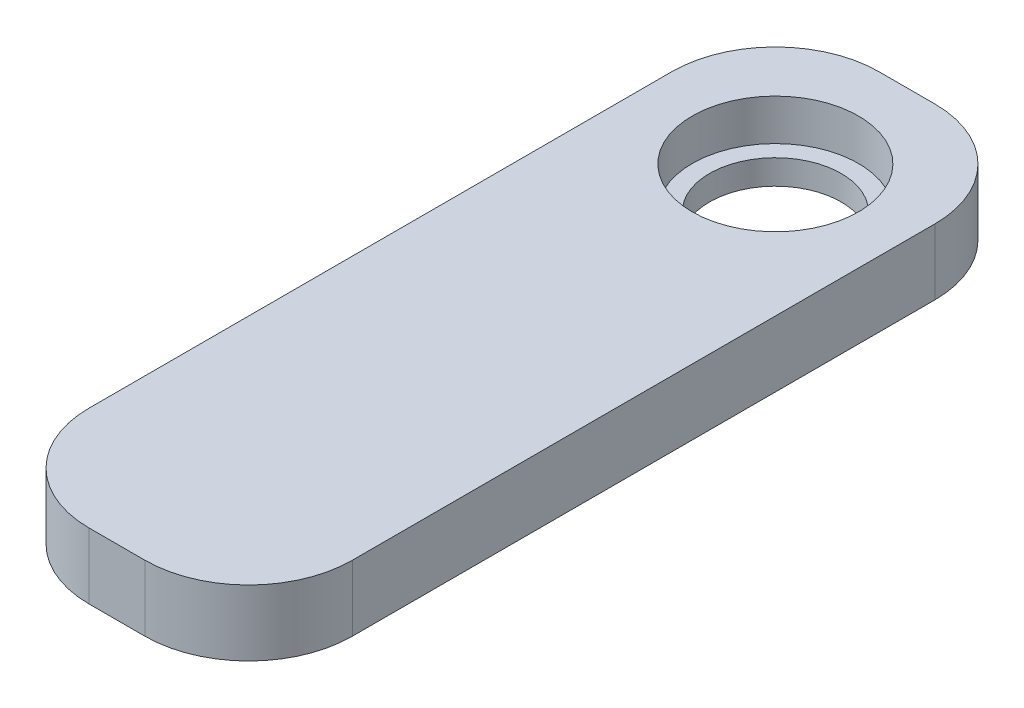
ISO-10303-21;
HEADER;
FILE_DESCRIPTION(('STEP AP214'),'2;1');
FILE_NAME('part.step','',(''),(''),'','','');
FILE_SCHEMA(('AUTOMOTIVE_DESIGN { 1 0 10303 214 1 1 1 1 }'));
ENDSEC;
DATA;
#1=APPLICATION_CONTEXT('core data for automotive mechanical design processes');
#2=APPLICATION_PROTOCOL_DEFINITION('international standard','automotive_design',2000,#1);
#3=PRODUCT_CONTEXT('',#1,'mechanical');
#4=PRODUCT('Part','Part','',(#3));
#5=PRODUCT_RELATED_PRODUCT_CATEGORY('part','',(#4));
#6=PRODUCT_DEFINITION_FORMATION('','',#4);
#7=PRODUCT_DEFINITION_CONTEXT('part definition',#1,'design');
#8=PRODUCT_DEFINITION('design','',#6,#7);
#9=PRODUCT_DEFINITION_SHAPE('','',#8);
#10=(LENGTH_UNIT() NAMED_UNIT(*) SI_UNIT(.MILLI.,.METRE.));
#11=(NAMED_UNIT(*) PLANE_ANGLE_UNIT() SI_UNIT($,.RADIAN.));
#12=(NAMED_UNIT(*) SI_UNIT($,.STERADIAN.) SOLID_ANGLE_UNIT());
#13=UNCERTAINTY_MEASURE_WITH_UNIT(LENGTH_MEASURE(1.E-05),#10,'distance_accuracy_value','');
#14=(GEOMETRIC_REPRESENTATION_CONTEXT(3) GLOBAL_UNCERTAINTY_ASSIGNED_CONTEXT((#13)) GLOBAL_UNIT_ASSIGNED_CONTEXT((#10,
#11,#12)) REPRESENTATION_CONTEXT('',''));
#15=CARTESIAN_POINT('',(0.,0.,0.));
#16=DIRECTION('',(0.,0.,1.));
#17=DIRECTION('',(1.,0.,0.));
#18=AXIS2_PLACEMENT_3D('',#15,#16,#17);
#19=CARTESIAN_POINT('',(0.,6.35,0.));
#20=DIRECTION('',(1.,0.,0.));
#21=DIRECTION('',(0.,0.,-1.));
#22=AXIS2_PLACEMENT_3D('',#19,#20,#21);
#23=PLANE('',#22);
#24=DIRECTION('',(0.,0.,1.));
#25=VECTOR('',#24,1.);
#26=CARTESIAN_POINT('',(0.,0.,0.));
#27=LINE('',#26,#25);
#28=CARTESIAN_POINT('',(0.,0.,-66.2));
#29=VERTEX_POINT('',#28);
#30=CARTESIAN_POINT('',(0.,0.,-9.99999999999999));
#31=VERTEX_POINT('',#30);
#32=EDGE_CURVE('E193',#29,#31,#27,.T.);
#33=ORIENTED_EDGE('',*,*,#32,.T.);
#34=DIRECTION('',(0.,-1.,0.));
#35=VECTOR('',#34,1.);
#36=CARTESIAN_POINT('',(0.,6.35,-10.));
#37=LINE('',#36,#35);
#38=CARTESIAN_POINT('',(0.,6.35,-9.99999999999999));
#39=VERTEX_POINT('',#38);
#40=EDGE_CURVE('E149',#31,#39,#37,.F.);
#41=ORIENTED_EDGE('',*,*,#40,.T.);
#42=DIRECTION('',(0.,0.,1.));
#43=VECTOR('',#42,1.);
#44=CARTESIAN_POINT('',(0.,6.35,0.));
#45=LINE('',#44,#43);
#46=CARTESIAN_POINT('',(0.,6.35,-66.2));
#47=VERTEX_POINT('',#46);
#48=EDGE_CURVE('E175',#47,#39,#45,.T.);
#49=ORIENTED_EDGE('',*,*,#48,.F.);
#50=DIRECTION('',(0.,-1.,0.));
#51=VECTOR('',#50,1.);
#52=CARTESIAN_POINT('',(0.,6.35,-66.2));
#53=LINE('',#52,#51);
#54=EDGE_CURVE('E146',#47,#29,#53,.T.);
#55=ORIENTED_EDGE('',*,*,#54,.T.);
#56=EDGE_LOOP('',(#33,#41,#49,#55));
#57=FACE_BOUND('',#56,.T.);
#58=ADVANCED_FACE('F35',(#57),#23,.F.);
#59=CARTESIAN_POINT('',(0.,6.35,0.));
#60=DIRECTION('',(0.,0.,-1.));
#61=DIRECTION('',(-1.,0.,0.));
#62=AXIS2_PLACEMENT_3D('',#59,#60,#61);
#63=PLANE('',#62);
#64=DIRECTION('',(1.,0.,0.));
#65=VECTOR('',#64,1.);
#66=CARTESIAN_POINT('',(0.,6.35,0.));
#67=LINE('',#66,#65);
#68=CARTESIAN_POINT('',(10.,6.35,0.));
#69=VERTEX_POINT('',#68);
#70=CARTESIAN_POINT('',(15.4,6.35,0.));
#71=VERTEX_POINT('',#70);
#72=EDGE_CURVE('E179',#69,#71,#67,.T.);
#73=ORIENTED_EDGE('',*,*,#72,.F.);
#74=DIRECTION('',(0.,-1.,0.));
#75=VECTOR('',#74,1.);
#76=CARTESIAN_POINT('',(10.,6.35,0.));
#77=LINE('',#76,#75);
#78=CARTESIAN_POINT('',(10.,0.,0.));
#79=VERTEX_POINT('',#78);
#80=EDGE_CURVE('E132',#69,#79,#77,.T.);
#81=ORIENTED_EDGE('',*,*,#80,.T.);
#82=DIRECTION('',(1.,0.,0.));
#83=VECTOR('',#82,1.);
#84=CARTESIAN_POINT('',(0.,0.,0.));
#85=LINE('',#84,#83);
#86=CARTESIAN_POINT('',(15.4,0.,0.));
#87=VERTEX_POINT('',#86);
#88=EDGE_CURVE('E181',#79,#87,#85,.T.);
#89=ORIENTED_EDGE('',*,*,#88,.T.);
#90=DIRECTION('',(0.,-1.,0.));
#91=VECTOR('',#90,1.);
#92=CARTESIAN_POINT('',(15.4,6.35,0.));
#93=LINE('',#92,#91);
#94=EDGE_CURVE('E130',#87,#71,#93,.F.);
#95=ORIENTED_EDGE('',*,*,#94,.T.);
#96=EDGE_LOOP('',(#73,#81,#89,#95));
#97=FACE_BOUND('',#96,.T.);
#98=ADVANCED_FACE('F200',(#97),#63,.F.);
#99=CARTESIAN_POINT('',(25.4,6.35,0.));
#100=DIRECTION('',(-1.,0.,0.));
#101=DIRECTION('',(0.,0.,1.));
#102=AXIS2_PLACEMENT_3D('',#99,#100,#101);
#103=PLANE('',#102);
#104=DIRECTION('',(0.,0.,-1.));
#105=VECTOR('',#104,1.);
#106=CARTESIAN_POINT('',(25.4,6.35,0.));
#107=LINE('',#106,#105);
#108=CARTESIAN_POINT('',(25.4,6.35,-10.));
#109=VERTEX_POINT('',#108);
#110=CARTESIAN_POINT('',(25.4,6.35,-66.2));
#111=VERTEX_POINT('',#110);
#112=EDGE_CURVE('E187',#109,#111,#107,.T.);
#113=ORIENTED_EDGE('',*,*,#112,.F.);
#114=DIRECTION('',(0.,-1.,0.));
#115=VECTOR('',#114,1.);
#116=CARTESIAN_POINT('',(25.4,6.35,-10.));
#117=LINE('',#116,#115);
#118=CARTESIAN_POINT('',(25.4,0.,-10.));
#119=VERTEX_POINT('',#118);
#120=EDGE_CURVE('E160',#109,#119,#117,.T.);
#121=ORIENTED_EDGE('',*,*,#120,.T.);
#122=DIRECTION('',(0.,0.,-1.));
#123=VECTOR('',#122,1.);
#124=CARTESIAN_POINT('',(25.4,0.,0.));
#125=LINE('',#124,#123);
#126=CARTESIAN_POINT('',(25.4,0.,-66.2));
#127=VERTEX_POINT('',#126);
#128=EDGE_CURVE('E176',#119,#127,#125,.T.);
#129=ORIENTED_EDGE('',*,*,#128,.T.);
#130=DIRECTION('',(0.,-1.,0.));
#131=VECTOR('',#130,1.);
#132=CARTESIAN_POINT('',(25.4,6.35,-66.2));
#133=LINE('',#132,#131);
#134=EDGE_CURVE('E158',#127,#111,#133,.F.);
#135=ORIENTED_EDGE('',*,*,#134,.T.);
#136=EDGE_LOOP('',(#113,#121,#129,#135));
#137=FACE_BOUND('',#136,.T.);
#138=ADVANCED_FACE('F211',(#137),#103,.F.);
#139=CARTESIAN_POINT('',(0.,6.35,-76.2));
#140=DIRECTION('',(0.,0.,1.));
#141=DIRECTION('',(1.,0.,0.));
#142=AXIS2_PLACEMENT_3D('',#139,#140,#141);
#143=PLANE('',#142);
#144=DIRECTION('',(-1.,0.,0.));
#145=VECTOR('',#144,1.);
#146=CARTESIAN_POINT('',(0.,0.,-76.2));
#147=LINE('',#146,#145);
#148=CARTESIAN_POINT('',(15.4,0.,-76.2));
#149=VERTEX_POINT('',#148);
#150=CARTESIAN_POINT('',(9.99999999999998,0.,-76.2));
#151=VERTEX_POINT('',#150);
#152=EDGE_CURVE('E166',#149,#151,#147,.T.);
#153=ORIENTED_EDGE('',*,*,#152,.T.);
#154=DIRECTION('',(0.,-1.,0.));
#155=VECTOR('',#154,1.);
#156=CARTESIAN_POINT('',(9.99999999999998,6.35,-76.2));
#157=LINE('',#156,#155);
#158=CARTESIAN_POINT('',(9.99999999999998,6.35,-76.2));
#159=VERTEX_POINT('',#158);
#160=EDGE_CURVE('E11',#151,#159,#157,.F.);
#161=ORIENTED_EDGE('',*,*,#160,.T.);
#162=DIRECTION('',(-1.,0.,0.));
#163=VECTOR('',#162,1.);
#164=CARTESIAN_POINT('',(0.,6.35,-76.2));
#165=LINE('',#164,#163);
#166=CARTESIAN_POINT('',(15.4,6.35,-76.2));
#167=VERTEX_POINT('',#166);
#168=EDGE_CURVE('E167',#167,#159,#165,.T.);
#169=ORIENTED_EDGE('',*,*,#168,.F.);
#170=DIRECTION('',(0.,-1.,0.));
#171=VECTOR('',#170,1.);
#172=CARTESIAN_POINT('',(15.4,6.35,-76.2));
#173=LINE('',#172,#171);
#174=EDGE_CURVE('E43',#167,#149,#173,.T.);
#175=ORIENTED_EDGE('',*,*,#174,.T.);
#176=EDGE_LOOP('',(#153,#161,#169,#175));
#177=FACE_BOUND('',#176,.T.);
#178=ADVANCED_FACE('F165',(#177),#143,.F.);
#179=CARTESIAN_POINT('',(0.,6.35,0.));
#180=DIRECTION('',(0.,-1.,0.));
#181=DIRECTION('',(0.,0.,-1.));
#182=AXIS2_PLACEMENT_3D('',#179,#180,#181);
#183=PLANE('',#182);
#184=ORIENTED_EDGE('',*,*,#48,.T.);
#185=CARTESIAN_POINT('',(10.,6.35,-10.));
#186=DIRECTION('',(0.,-1.,0.));
#187=DIRECTION('',(0.,0.,-1.));
#188=AXIS2_PLACEMENT_3D('',#185,#186,#187);
#189=CIRCLE('',#188,10.);
#190=EDGE_CURVE('E156',#39,#69,#189,.F.);
#191=ORIENTED_EDGE('',*,*,#190,.T.);
#192=ORIENTED_EDGE('',*,*,#72,.T.);
#193=CARTESIAN_POINT('',(15.4,6.35,-10.));
#194=DIRECTION('',(0.,-1.,0.));
#195=DIRECTION('',(0.,0.,-1.));
#196=AXIS2_PLACEMENT_3D('',#193,#194,#195);
#197=CIRCLE('',#196,10.);
#198=EDGE_CURVE('E154',#71,#109,#197,.F.);
#199=ORIENTED_EDGE('',*,*,#198,.T.);
#200=ORIENTED_EDGE('',*,*,#112,.T.);
#201=CARTESIAN_POINT('',(15.4,6.35,-66.2));
#202=DIRECTION('',(0.,-1.,0.));
#203=DIRECTION('',(0.,0.,-1.));
#204=AXIS2_PLACEMENT_3D('',#201,#202,#203);
#205=CIRCLE('',#204,10.);
#206=EDGE_CURVE('E55',#111,#167,#205,.F.);
#207=ORIENTED_EDGE('',*,*,#206,.T.);
#208=ORIENTED_EDGE('',*,*,#168,.T.);
#209=CARTESIAN_POINT('',(9.99999999999998,6.35,-66.2));
#210=DIRECTION('',(0.,-1.,0.));
#211=DIRECTION('',(0.,0.,-1.));
#212=AXIS2_PLACEMENT_3D('',#209,#210,#211);
#213=CIRCLE('',#212,10.);
#214=EDGE_CURVE('E152',#159,#47,#213,.F.);
#215=ORIENTED_EDGE('',*,*,#214,.T.);
#216=EDGE_LOOP('',(#184,#191,#192,#199,#200,#207,#208,#215));
#217=FACE_BOUND('',#216,.T.);
#218=CARTESIAN_POINT('',(12.7,6.35,-63.5));
#219=DIRECTION('',(0.,1.,0.));
#220=DIRECTION('',(0.,0.,1.));
#221=AXIS2_PLACEMENT_3D('',#218,#219,#220);
#222=CIRCLE('',#221,8.016875);
#223=CARTESIAN_POINT('',(12.7,6.35,-55.483125));
#224=VERTEX_POINT('',#223);
#225=EDGE_CURVE('E367',#224,#224,#222,.T.);
#226=ORIENTED_EDGE('',*,*,#225,.F.);
#227=EDGE_LOOP('',(#226));
#228=FACE_BOUND('',#227,.T.);
#229=ADVANCED_FACE('F208',(#217,#228),#183,.F.);
#230=CARTESIAN_POINT('',(0.,0.,0.));
#231=DIRECTION('',(0.,-1.,0.));
#232=DIRECTION('',(0.,0.,-1.));
#233=AXIS2_PLACEMENT_3D('',#230,#231,#232);
#234=PLANE('',#233);
#235=CARTESIAN_POINT('',(12.7,0.,-6.35));
#236=DIRECTION('',(0.,-1.,0.));
#237=DIRECTION('',(0.,0.,-1.));
#238=AXIS2_PLACEMENT_3D('',#235,#236,#237);
#239=CIRCLE('',#238,3.429);
#240=CARTESIAN_POINT('',(15.1611800503011,0.,-8.7376));
#241=VERTEX_POINT('',#240);
#242=CARTESIAN_POINT('',(10.2388199496989,0.,-8.7376));
#243=VERTEX_POINT('',#242);
#244=EDGE_CURVE('E185',#241,#243,#239,.T.);
#245=ORIENTED_EDGE('',*,*,#244,.F.);
#246=DIRECTION('',(1.,0.,0.));
#247=VECTOR('',#246,1.);
#248=CARTESIAN_POINT('',(17.9251449243623,0.,-8.7376));
#249=LINE('',#248,#247);
#250=EDGE_CURVE('E119',#243,#241,#249,.T.);
#251=ORIENTED_EDGE('',*,*,#250,.F.);
#252=EDGE_LOOP('',(#245,#251));
#253=FACE_BOUND('',#252,.T.);
#254=CARTESIAN_POINT('',(12.7,0.,-63.5));
#255=DIRECTION('',(0.,1.,0.));
#256=DIRECTION('',(0.,0.,1.));
#257=AXIS2_PLACEMENT_3D('',#254,#255,#256);
#258=CIRCLE('',#257,6.35);
#259=CARTESIAN_POINT('',(12.7,0.,-57.15));
#260=VERTEX_POINT('',#259);
#261=EDGE_CURVE('E363',#260,#260,#258,.T.);
#262=ORIENTED_EDGE('',*,*,#261,.T.);
#263=EDGE_LOOP('',(#262));
#264=FACE_BOUND('',#263,.T.);
#265=ORIENTED_EDGE('',*,*,#88,.F.);
#266=CARTESIAN_POINT('',(10.,0.,-10.));
#267=DIRECTION('',(0.,-1.,0.));
#268=DIRECTION('',(0.,0.,-1.));
#269=AXIS2_PLACEMENT_3D('',#266,#267,#268);
#270=CIRCLE('',#269,10.);
#271=EDGE_CURVE('E144',#79,#31,#270,.T.);
#272=ORIENTED_EDGE('',*,*,#271,.T.);
#273=ORIENTED_EDGE('',*,*,#32,.F.);
#274=CARTESIAN_POINT('',(9.99999999999998,0.,-66.2));
#275=DIRECTION('',(0.,-1.,0.));
#276=DIRECTION('',(0.,0.,-1.));
#277=AXIS2_PLACEMENT_3D('',#274,#275,#276);
#278=CIRCLE('',#277,10.);
#279=EDGE_CURVE('E140',#29,#151,#278,.T.);
#280=ORIENTED_EDGE('',*,*,#279,.T.);
#281=ORIENTED_EDGE('',*,*,#152,.F.);
#282=CARTESIAN_POINT('',(15.4,0.,-66.2));
#283=DIRECTION('',(0.,-1.,0.));
#284=DIRECTION('',(0.,0.,-1.));
#285=AXIS2_PLACEMENT_3D('',#282,#283,#284);
#286=CIRCLE('',#285,10.);
#287=EDGE_CURVE('E138',#149,#127,#286,.T.);
#288=ORIENTED_EDGE('',*,*,#287,.T.);
#289=ORIENTED_EDGE('',*,*,#128,.F.);
#290=CARTESIAN_POINT('',(15.4,0.,-10.));
#291=DIRECTION('',(0.,-1.,0.));
#292=DIRECTION('',(0.,0.,-1.));
#293=AXIS2_PLACEMENT_3D('',#290,#291,#292);
#294=CIRCLE('',#293,10.);
#295=EDGE_CURVE('E142',#119,#87,#294,.T.);
#296=ORIENTED_EDGE('',*,*,#295,.T.);
#297=EDGE_LOOP('',(#265,#272,#273,#280,#281,#288,#289,#296));
#298=FACE_BOUND('',#297,.T.);
#299=ADVANCED_FACE('F171',(#253,#264,#298),#234,.T.);
#300=CARTESIAN_POINT('',(12.7,2.38125,-63.5));
#301=DIRECTION('',(0.,1.,0.));
#302=DIRECTION('',(0.,0.,1.));
#303=AXIS2_PLACEMENT_3D('',#300,#301,#302);
#304=CYLINDRICAL_SURFACE('',#303,8.016875);
#305=CARTESIAN_POINT('',(12.7,2.38125,-63.5));
#306=DIRECTION('',(0.,1.,0.));
#307=DIRECTION('',(0.,0.,1.));
#308=AXIS2_PLACEMENT_3D('',#305,#306,#307);
#309=CIRCLE('',#308,8.016875);
#310=CARTESIAN_POINT('',(12.7,2.38125,-55.483125));
#311=VERTEX_POINT('',#310);
#312=EDGE_CURVE('E195',#311,#311,#309,.T.);
#313=ORIENTED_EDGE('',*,*,#312,.F.);
#314=EDGE_LOOP('',(#313));
#315=FACE_BOUND('',#314,.T.);
#316=ORIENTED_EDGE('',*,*,#225,.T.);
#317=EDGE_LOOP('',(#316));
#318=FACE_BOUND('',#317,.T.);
#319=ADVANCED_FACE('F289',(#315,#318),#304,.F.);
#320=CARTESIAN_POINT('',(12.7,2.38125,-63.5));
#321=DIRECTION('',(0.,1.,0.));
#322=DIRECTION('',(0.,0.,1.));
#323=AXIS2_PLACEMENT_3D('',#320,#321,#322);
#324=PLANE('',#323);
#325=CARTESIAN_POINT('',(12.7,2.38125,-63.5));
#326=DIRECTION('',(0.,1.,0.));
#327=DIRECTION('',(0.,0.,1.));
#328=AXIS2_PLACEMENT_3D('',#325,#326,#327);
#329=CIRCLE('',#328,6.35);
#330=CARTESIAN_POINT('',(12.7,2.38125,-57.15));
#331=VERTEX_POINT('',#330);
#332=EDGE_CURVE('E186',#331,#331,#329,.T.);
#333=ORIENTED_EDGE('',*,*,#332,.F.);
#334=EDGE_LOOP('',(#333));
#335=FACE_BOUND('',#334,.T.);
#336=ORIENTED_EDGE('',*,*,#312,.T.);
#337=EDGE_LOOP('',(#336));
#338=FACE_BOUND('',#337,.T.);
#339=ADVANCED_FACE('F301',(#335,#338),#324,.T.);
#340=CARTESIAN_POINT('',(12.7,0.,-63.5));
#341=DIRECTION('',(0.,1.,0.));
#342=DIRECTION('',(0.,0.,1.));
#343=AXIS2_PLACEMENT_3D('',#340,#341,#342);
#344=CYLINDRICAL_SURFACE('',#343,6.35);
#345=ORIENTED_EDGE('',*,*,#261,.F.);
#346=EDGE_LOOP('',(#345));
#347=FACE_BOUND('',#346,.T.);
#348=ORIENTED_EDGE('',*,*,#332,.T.);
#349=EDGE_LOOP('',(#348));
#350=FACE_BOUND('',#349,.T.);
#351=ADVANCED_FACE('F308',(#347,#350),#344,.F.);
#352=CARTESIAN_POINT('',(12.7,-1.27,-6.35));
#353=DIRECTION('',(0.,1.,0.));
#354=DIRECTION('',(0.,0.,1.));
#355=AXIS2_PLACEMENT_3D('',#352,#353,#354);
#356=CYLINDRICAL_SURFACE('',#355,3.429);
#357=DIRECTION('',(0.,1.,0.));
#358=VECTOR('',#357,1.);
#359=CARTESIAN_POINT('',(10.2388199496989,-1.27,-8.7376));
#360=LINE('',#359,#358);
#361=CARTESIAN_POINT('',(10.2388199496989,5.08,-8.7376));
#362=VERTEX_POINT('',#361);
#363=EDGE_CURVE('E122',#243,#362,#360,.T.);
#364=ORIENTED_EDGE('',*,*,#363,.T.);
#365=CARTESIAN_POINT('',(12.7,5.08,-6.35));
#366=DIRECTION('',(0.,-1.,0.));
#367=DIRECTION('',(0.,0.,-1.));
#368=AXIS2_PLACEMENT_3D('',#365,#366,#367);
#369=CIRCLE('',#368,3.429);
#370=CARTESIAN_POINT('',(15.1611800503011,5.08,-8.7376));
#371=VERTEX_POINT('',#370);
#372=EDGE_CURVE('E125',#362,#371,#369,.F.);
#373=ORIENTED_EDGE('',*,*,#372,.T.);
#374=DIRECTION('',(0.,1.,0.));
#375=VECTOR('',#374,1.);
#376=CARTESIAN_POINT('',(15.1611800503011,-1.27,-8.7376));
#377=LINE('',#376,#375);
#378=EDGE_CURVE('E111',#371,#241,#377,.F.);
#379=ORIENTED_EDGE('',*,*,#378,.T.);
#380=ORIENTED_EDGE('',*,*,#244,.T.);
#381=EDGE_LOOP('',(#364,#373,#379,#380));
#382=FACE_BOUND('',#381,.T.);
#383=ADVANCED_FACE('F126',(#382),#356,.F.);
#384=CARTESIAN_POINT('',(17.9251449243623,0.,-8.7376));
#385=DIRECTION('',(0.,0.,1.));
#386=DIRECTION('',(1.,0.,0.));
#387=AXIS2_PLACEMENT_3D('',#384,#385,#386);
#388=PLANE('',#387);
#389=DIRECTION('',(1.,0.,0.));
#390=VECTOR('',#389,1.);
#391=CARTESIAN_POINT('',(17.9251449243623,5.08,-8.7376));
#392=LINE('',#391,#390);
#393=EDGE_CURVE('E116',#362,#371,#392,.T.);
#394=ORIENTED_EDGE('',*,*,#393,.F.);
#395=ORIENTED_EDGE('',*,*,#363,.F.);
#396=ORIENTED_EDGE('',*,*,#250,.T.);
#397=ORIENTED_EDGE('',*,*,#378,.F.);
#398=EDGE_LOOP('',(#394,#395,#396,#397));
#399=FACE_BOUND('',#398,.T.);
#400=ADVANCED_FACE('F113',(#399),#388,.T.);
#401=CARTESIAN_POINT('',(0.,5.08,0.));
#402=DIRECTION('',(0.,-1.,0.));
#403=DIRECTION('',(0.,0.,-1.));
#404=AXIS2_PLACEMENT_3D('',#401,#402,#403);
#405=PLANE('',#404);
#406=ORIENTED_EDGE('',*,*,#372,.F.);
#407=ORIENTED_EDGE('',*,*,#393,.T.);
#408=EDGE_LOOP('',(#406,#407));
#409=FACE_BOUND('',#408,.T.);
#410=ADVANCED_FACE('F129',(#409),#405,.T.);
#411=CARTESIAN_POINT('',(10.,6.35,-10.));
#412=DIRECTION('',(0.,-1.,0.));
#413=DIRECTION('',(0.,0.,-1.));
#414=AXIS2_PLACEMENT_3D('',#411,#412,#413);
#415=CYLINDRICAL_SURFACE('',#414,10.);
#416=ORIENTED_EDGE('',*,*,#190,.F.);
#417=ORIENTED_EDGE('',*,*,#40,.F.);
#418=ORIENTED_EDGE('',*,*,#271,.F.);
#419=ORIENTED_EDGE('',*,*,#80,.F.);
#420=EDGE_LOOP('',(#416,#417,#418,#419));
#421=FACE_BOUND('',#420,.T.);
#422=ADVANCED_FACE('F229',(#421),#415,.T.);
#423=CARTESIAN_POINT('',(15.4,6.35,-10.));
#424=DIRECTION('',(0.,-1.,0.));
#425=DIRECTION('',(0.,0.,-1.));
#426=AXIS2_PLACEMENT_3D('',#423,#424,#425);
#427=CYLINDRICAL_SURFACE('',#426,10.);
#428=ORIENTED_EDGE('',*,*,#198,.F.);
#429=ORIENTED_EDGE('',*,*,#94,.F.);
#430=ORIENTED_EDGE('',*,*,#295,.F.);
#431=ORIENTED_EDGE('',*,*,#120,.F.);
#432=EDGE_LOOP('',(#428,#429,#430,#431));
#433=FACE_BOUND('',#432,.T.);
#434=ADVANCED_FACE('F205',(#433),#427,.T.);
#435=CARTESIAN_POINT('',(9.99999999999998,6.35,-66.2));
#436=DIRECTION('',(0.,-1.,0.));
#437=DIRECTION('',(0.,0.,-1.));
#438=AXIS2_PLACEMENT_3D('',#435,#436,#437);
#439=CYLINDRICAL_SURFACE('',#438,10.);
#440=ORIENTED_EDGE('',*,*,#214,.F.);
#441=ORIENTED_EDGE('',*,*,#160,.F.);
#442=ORIENTED_EDGE('',*,*,#279,.F.);
#443=ORIENTED_EDGE('',*,*,#54,.F.);
#444=EDGE_LOOP('',(#440,#441,#442,#443));
#445=FACE_BOUND('',#444,.T.);
#446=ADVANCED_FACE('F214',(#445),#439,.T.);
#447=CARTESIAN_POINT('',(15.4,6.35,-66.2));
#448=DIRECTION('',(0.,-1.,0.));
#449=DIRECTION('',(0.,0.,-1.));
#450=AXIS2_PLACEMENT_3D('',#447,#448,#449);
#451=CYLINDRICAL_SURFACE('',#450,10.);
#452=ORIENTED_EDGE('',*,*,#206,.F.);
#453=ORIENTED_EDGE('',*,*,#134,.F.);
#454=ORIENTED_EDGE('',*,*,#287,.F.);
#455=ORIENTED_EDGE('',*,*,#174,.F.);
#456=EDGE_LOOP('',(#452,#453,#454,#455));
#457=FACE_BOUND('',#456,.T.);
#458=ADVANCED_FACE('F37',(#457),#451,.T.);
#459=CLOSED_SHELL('',(#58,#98,#138,#178,#229,#299,#319,#339,#351,#383,#400,#410,#422,#434,#446,#458));
#460=MANIFOLD_SOLID_BREP('B2',#459);
#461=ADVANCED_BREP_SHAPE_REPRESENTATION('',(#18,#460),#14);
#462=SHAPE_DEFINITION_REPRESENTATION(#9,#461);
ENDSEC;
END-ISO-10303-21;
